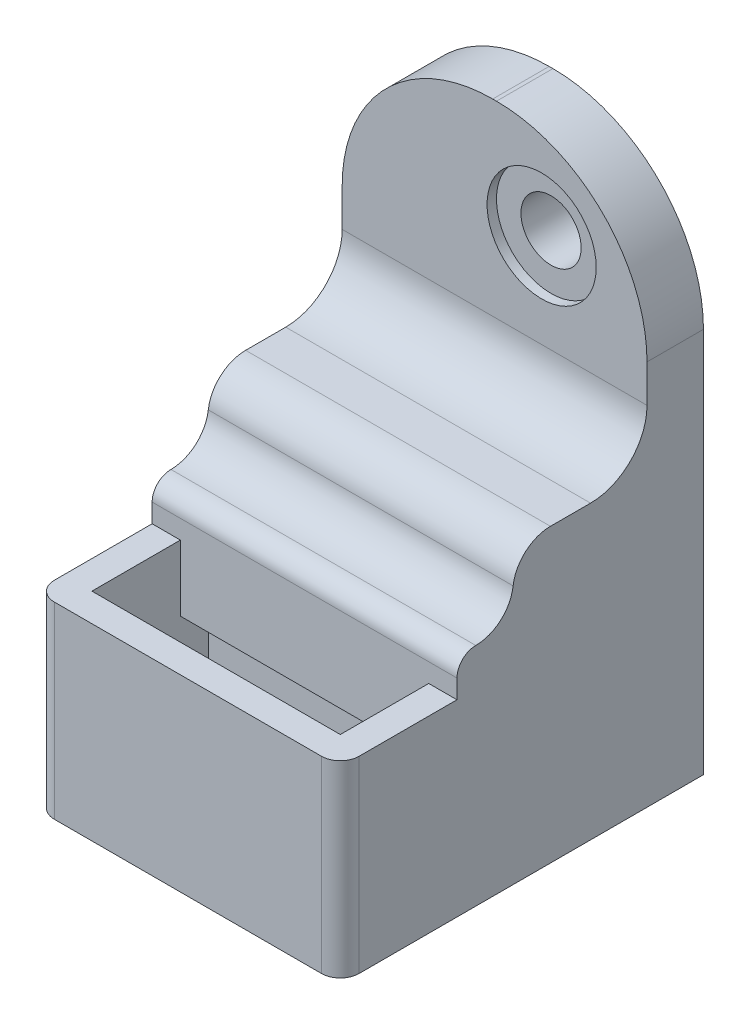
ISO-10303-21;
HEADER;
FILE_DESCRIPTION(('STEP AP214'),'2;1');
FILE_NAME('part.step','',(''),(''),'','','');
FILE_SCHEMA(('AUTOMOTIVE_DESIGN { 1 0 10303 214 1 1 1 1 }'));
ENDSEC;
DATA;
#1=APPLICATION_CONTEXT('core data for automotive mechanical design processes');
#2=APPLICATION_PROTOCOL_DEFINITION('international standard','automotive_design',2000,#1);
#3=PRODUCT_CONTEXT('',#1,'mechanical');
#4=PRODUCT('Part','Part','',(#3));
#5=PRODUCT_RELATED_PRODUCT_CATEGORY('part','',(#4));
#6=PRODUCT_DEFINITION_FORMATION('','',#4);
#7=PRODUCT_DEFINITION_CONTEXT('part definition',#1,'design');
#8=PRODUCT_DEFINITION('design','',#6,#7);
#9=PRODUCT_DEFINITION_SHAPE('','',#8);
#10=(LENGTH_UNIT() NAMED_UNIT(*) SI_UNIT(.MILLI.,.METRE.));
#11=(NAMED_UNIT(*) PLANE_ANGLE_UNIT() SI_UNIT($,.RADIAN.));
#12=(NAMED_UNIT(*) SI_UNIT($,.STERADIAN.) SOLID_ANGLE_UNIT());
#13=UNCERTAINTY_MEASURE_WITH_UNIT(LENGTH_MEASURE(1.E-05),#10,'distance_accuracy_value','');
#14=(GEOMETRIC_REPRESENTATION_CONTEXT(3) GLOBAL_UNCERTAINTY_ASSIGNED_CONTEXT((#13)) GLOBAL_UNIT_ASSIGNED_CONTEXT((#10,
#11,#12)) REPRESENTATION_CONTEXT('',''));
#15=CARTESIAN_POINT('',(0.,0.,0.));
#16=DIRECTION('',(0.,0.,1.));
#17=DIRECTION('',(1.,0.,0.));
#18=AXIS2_PLACEMENT_3D('',#15,#16,#17);
#19=CARTESIAN_POINT('',(0.,6.5,0.));
#20=DIRECTION('',(1.,0.,0.));
#21=DIRECTION('',(0.,0.,-1.));
#22=AXIS2_PLACEMENT_3D('',#19,#20,#21);
#23=PLANE('',#22);
#24=DIRECTION('',(0.,0.,-1.));
#25=VECTOR('',#24,1.);
#26=CARTESIAN_POINT('',(0.,3.,1.5));
#27=LINE('',#26,#25);
#28=CARTESIAN_POINT('',(0.,3.,1.5));
#29=VERTEX_POINT('',#28);
#30=CARTESIAN_POINT('',(0.,3.,0.));
#31=VERTEX_POINT('',#30);
#32=EDGE_CURVE('E209',#29,#31,#27,.T.);
#33=ORIENTED_EDGE('',*,*,#32,.F.);
#34=DIRECTION('',(0.,1.,0.));
#35=VECTOR('',#34,1.);
#36=CARTESIAN_POINT('',(0.,3.,1.5));
#37=LINE('',#36,#35);
#38=CARTESIAN_POINT('',(0.,6.5,1.5));
#39=VERTEX_POINT('',#38);
#40=EDGE_CURVE('E217',#29,#39,#37,.T.);
#41=ORIENTED_EDGE('',*,*,#40,.T.);
#42=DIRECTION('',(0.,0.,1.));
#43=VECTOR('',#42,1.);
#44=CARTESIAN_POINT('',(0.,6.5,0.));
#45=LINE('',#44,#43);
#46=CARTESIAN_POINT('',(0.,6.5,6.2));
#47=VERTEX_POINT('',#46);
#48=EDGE_CURVE('E331',#39,#47,#45,.T.);
#49=ORIENTED_EDGE('',*,*,#48,.T.);
#50=DIRECTION('',(0.,-1.,0.));
#51=VECTOR('',#50,1.);
#52=CARTESIAN_POINT('',(0.,6.5,6.2));
#53=LINE('',#52,#51);
#54=CARTESIAN_POINT('',(0.,-3.5,6.2));
#55=VERTEX_POINT('',#54);
#56=EDGE_CURVE('E343',#47,#55,#53,.T.);
#57=ORIENTED_EDGE('',*,*,#56,.T.);
#58=DIRECTION('',(0.,0.,-1.));
#59=VECTOR('',#58,1.);
#60=CARTESIAN_POINT('',(0.,-3.5,0.));
#61=LINE('',#60,#59);
#62=CARTESIAN_POINT('',(0.,-3.5,0.));
#63=VERTEX_POINT('',#62);
#64=EDGE_CURVE('E244',#55,#63,#61,.T.);
#65=ORIENTED_EDGE('',*,*,#64,.T.);
#66=DIRECTION('',(0.,-1.,0.));
#67=VECTOR('',#66,1.);
#68=CARTESIAN_POINT('',(0.,6.5,0.));
#69=LINE('',#68,#67);
#70=EDGE_CURVE('E229',#31,#63,#69,.T.);
#71=ORIENTED_EDGE('',*,*,#70,.F.);
#72=EDGE_LOOP('',(#33,#41,#49,#57,#65,#71));
#73=FACE_BOUND('',#72,.T.);
#74=ADVANCED_FACE('F33',(#73),#23,.T.);
#75=CARTESIAN_POINT('',(13.2,6.5,0.));
#76=DIRECTION('',(-1.,0.,0.));
#77=DIRECTION('',(0.,0.,1.));
#78=AXIS2_PLACEMENT_3D('',#75,#76,#77);
#79=PLANE('',#78);
#80=DIRECTION('',(0.,0.,-1.));
#81=VECTOR('',#80,1.);
#82=CARTESIAN_POINT('',(13.2,6.5,0.));
#83=LINE('',#82,#81);
#84=CARTESIAN_POINT('',(13.2,6.5,6.2));
#85=VERTEX_POINT('',#84);
#86=CARTESIAN_POINT('',(13.2,6.5,1.5));
#87=VERTEX_POINT('',#86);
#88=EDGE_CURVE('E335',#85,#87,#83,.T.);
#89=ORIENTED_EDGE('',*,*,#88,.T.);
#90=DIRECTION('',(0.,1.,0.));
#91=VECTOR('',#90,1.);
#92=CARTESIAN_POINT('',(13.2,3.,1.5));
#93=LINE('',#92,#91);
#94=CARTESIAN_POINT('',(13.2,3.,1.5));
#95=VERTEX_POINT('',#94);
#96=EDGE_CURVE('E225',#95,#87,#93,.T.);
#97=ORIENTED_EDGE('',*,*,#96,.F.);
#98=DIRECTION('',(0.,0.,1.));
#99=VECTOR('',#98,1.);
#100=CARTESIAN_POINT('',(13.2,3.,0.));
#101=LINE('',#100,#99);
#102=CARTESIAN_POINT('',(13.2,3.,0.));
#103=VERTEX_POINT('',#102);
#104=EDGE_CURVE('E212',#103,#95,#101,.T.);
#105=ORIENTED_EDGE('',*,*,#104,.F.);
#106=DIRECTION('',(0.,-1.,0.));
#107=VECTOR('',#106,1.);
#108=CARTESIAN_POINT('',(13.2,6.5,0.));
#109=LINE('',#108,#107);
#110=CARTESIAN_POINT('',(13.2,-3.5,0.));
#111=VERTEX_POINT('',#110);
#112=EDGE_CURVE('E339',#103,#111,#109,.T.);
#113=ORIENTED_EDGE('',*,*,#112,.T.);
#114=DIRECTION('',(0.,0.,1.));
#115=VECTOR('',#114,1.);
#116=CARTESIAN_POINT('',(13.2,-3.5,6.2));
#117=LINE('',#116,#115);
#118=CARTESIAN_POINT('',(13.2,-3.5,6.2));
#119=VERTEX_POINT('',#118);
#120=EDGE_CURVE('E238',#111,#119,#117,.T.);
#121=ORIENTED_EDGE('',*,*,#120,.T.);
#122=DIRECTION('',(0.,-1.,0.));
#123=VECTOR('',#122,1.);
#124=CARTESIAN_POINT('',(13.2,6.5,6.2));
#125=LINE('',#124,#123);
#126=EDGE_CURVE('E341',#85,#119,#125,.T.);
#127=ORIENTED_EDGE('',*,*,#126,.F.);
#128=EDGE_LOOP('',(#89,#97,#105,#113,#121,#127));
#129=FACE_BOUND('',#128,.T.);
#130=ADVANCED_FACE('F467',(#129),#79,.T.);
#131=CARTESIAN_POINT('',(9.1,20.,-16.1254833995939));
#132=DIRECTION('',(0.,0.,1.));
#133=DIRECTION('',(1.,0.,0.));
#134=AXIS2_PLACEMENT_3D('',#131,#132,#133);
#135=CYLINDRICAL_SURFACE('',#134,1.6);
#136=CARTESIAN_POINT('',(9.1,20.,-11.6));
#137=DIRECTION('',(0.,0.,1.));
#138=DIRECTION('',(1.,0.,0.));
#139=AXIS2_PLACEMENT_3D('',#136,#137,#138);
#140=CIRCLE('',#139,1.6);
#141=CARTESIAN_POINT('',(10.7,20.,-11.6));
#142=VERTEX_POINT('',#141);
#143=EDGE_CURVE('E289',#142,#142,#140,.F.);
#144=ORIENTED_EDGE('',*,*,#143,.T.);
#145=EDGE_LOOP('',(#144));
#146=FACE_BOUND('',#145,.T.);
#147=CARTESIAN_POINT('',(9.1,20.,-9.1));
#148=DIRECTION('',(0.,0.,1.));
#149=DIRECTION('',(1.,0.,0.));
#150=AXIS2_PLACEMENT_3D('',#147,#148,#149);
#151=CIRCLE('',#150,1.6);
#152=CARTESIAN_POINT('',(10.7,20.,-9.1));
#153=VERTEX_POINT('',#152);
#154=EDGE_CURVE('E280',#153,#153,#151,.F.);
#155=ORIENTED_EDGE('',*,*,#154,.F.);
#156=EDGE_LOOP('',(#155));
#157=FACE_BOUND('',#156,.T.);
#158=ADVANCED_FACE('F525',(#146,#157),#135,.F.);
#159=CARTESIAN_POINT('',(-1.5,12.,-3.5));
#160=DIRECTION('',(0.,-1.,0.));
#161=DIRECTION('',(1.,0.,0.));
#162=AXIS2_PLACEMENT_3D('',#159,#160,#161);
#163=PLANE('',#162);
#164=DIRECTION('',(0.,0.,1.));
#165=VECTOR('',#164,1.);
#166=CARTESIAN_POINT('',(14.7,12.,-3.5));
#167=LINE('',#166,#165);
#168=CARTESIAN_POINT('',(14.7,12.,-5.6));
#169=VERTEX_POINT('',#168);
#170=CARTESIAN_POINT('',(14.7,12.,-3.46862696659689));
#171=VERTEX_POINT('',#170);
#172=EDGE_CURVE('E327',#169,#171,#167,.T.);
#173=ORIENTED_EDGE('',*,*,#172,.F.);
#174=DIRECTION('',(1.,0.,0.));
#175=VECTOR('',#174,1.);
#176=CARTESIAN_POINT('',(-1.5,12.,-5.6));
#177=LINE('',#176,#175);
#178=CARTESIAN_POINT('',(-1.5,12.,-5.6));
#179=VERTEX_POINT('',#178);
#180=EDGE_CURVE('E396',#169,#179,#177,.F.);
#181=ORIENTED_EDGE('',*,*,#180,.T.);
#182=DIRECTION('',(0.,0.,1.));
#183=VECTOR('',#182,1.);
#184=CARTESIAN_POINT('',(-1.5,12.,-3.5));
#185=LINE('',#184,#183);
#186=CARTESIAN_POINT('',(-1.5,12.,-3.46862696659689));
#187=VERTEX_POINT('',#186);
#188=EDGE_CURVE('E329',#179,#187,#185,.T.);
#189=ORIENTED_EDGE('',*,*,#188,.T.);
#190=DIRECTION('',(1.,0.,0.));
#191=VECTOR('',#190,1.);
#192=CARTESIAN_POINT('',(-1.5,12.,-3.46862696659689));
#193=LINE('',#192,#191);
#194=EDGE_CURVE('E383',#187,#171,#193,.T.);
#195=ORIENTED_EDGE('',*,*,#194,.T.);
#196=EDGE_LOOP('',(#173,#181,#189,#195));
#197=FACE_BOUND('',#196,.T.);
#198=ADVANCED_FACE('F486',(#197),#163,.F.);
#199=CARTESIAN_POINT('',(0.,6.5,0.));
#200=DIRECTION('',(0.,1.,0.));
#201=DIRECTION('',(0.,0.,1.));
#202=AXIS2_PLACEMENT_3D('',#199,#200,#201);
#203=PLANE('',#202);
#204=DIRECTION('',(0.,0.,1.));
#205=VECTOR('',#204,1.);
#206=CARTESIAN_POINT('',(-1.5,6.5,-1.5));
#207=LINE('',#206,#205);
#208=CARTESIAN_POINT('',(-1.5,6.5,1.5));
#209=VERTEX_POINT('',#208);
#210=CARTESIAN_POINT('',(-1.5,6.5,6.7));
#211=VERTEX_POINT('',#210);
#212=EDGE_CURVE('E345',#209,#211,#207,.T.);
#213=ORIENTED_EDGE('',*,*,#212,.T.);
#214=CARTESIAN_POINT('',(-0.5,6.5,6.7));
#215=DIRECTION('',(0.,1.,0.));
#216=DIRECTION('',(0.,0.,1.));
#217=AXIS2_PLACEMENT_3D('',#214,#215,#216);
#218=CIRCLE('',#217,1.);
#219=CARTESIAN_POINT('',(-0.5,6.5,7.7));
#220=VERTEX_POINT('',#219);
#221=EDGE_CURVE('E363',#211,#220,#218,.T.);
#222=ORIENTED_EDGE('',*,*,#221,.T.);
#223=DIRECTION('',(1.,0.,0.));
#224=VECTOR('',#223,1.);
#225=CARTESIAN_POINT('',(-1.5,6.5,7.7));
#226=LINE('',#225,#224);
#227=CARTESIAN_POINT('',(13.7,6.5,7.7));
#228=VERTEX_POINT('',#227);
#229=EDGE_CURVE('E348',#220,#228,#226,.T.);
#230=ORIENTED_EDGE('',*,*,#229,.T.);
#231=CARTESIAN_POINT('',(13.7,6.5,6.7));
#232=DIRECTION('',(0.,1.,0.));
#233=DIRECTION('',(0.,0.,1.));
#234=AXIS2_PLACEMENT_3D('',#231,#232,#233);
#235=CIRCLE('',#234,1.);
#236=CARTESIAN_POINT('',(14.7,6.5,6.7));
#237=VERTEX_POINT('',#236);
#238=EDGE_CURVE('E361',#228,#237,#235,.T.);
#239=ORIENTED_EDGE('',*,*,#238,.T.);
#240=DIRECTION('',(0.,0.,-1.));
#241=VECTOR('',#240,1.);
#242=CARTESIAN_POINT('',(14.7,6.5,-1.5));
#243=LINE('',#242,#241);
#244=CARTESIAN_POINT('',(14.7,6.5,1.5));
#245=VERTEX_POINT('',#244);
#246=EDGE_CURVE('E351',#237,#245,#243,.T.);
#247=ORIENTED_EDGE('',*,*,#246,.T.);
#248=DIRECTION('',(1.,0.,0.));
#249=VECTOR('',#248,1.);
#250=CARTESIAN_POINT('',(14.7,6.5,1.5));
#251=LINE('',#250,#249);
#252=EDGE_CURVE('E287',#87,#245,#251,.T.);
#253=ORIENTED_EDGE('',*,*,#252,.F.);
#254=ORIENTED_EDGE('',*,*,#88,.F.);
#255=DIRECTION('',(1.,0.,0.));
#256=VECTOR('',#255,1.);
#257=CARTESIAN_POINT('',(0.,6.5,6.2));
#258=LINE('',#257,#256);
#259=EDGE_CURVE('E333',#47,#85,#258,.T.);
#260=ORIENTED_EDGE('',*,*,#259,.F.);
#261=ORIENTED_EDGE('',*,*,#48,.F.);
#262=EDGE_CURVE('E221',#209,#39,#251,.T.);
#263=ORIENTED_EDGE('',*,*,#262,.F.);
#264=EDGE_LOOP('',(#213,#222,#230,#239,#247,#253,#254,#260,#261,#263));
#265=FACE_BOUND('',#264,.T.);
#266=ADVANCED_FACE('F452',(#265),#203,.T.);
#267=CARTESIAN_POINT('',(-1.5,6.5,-1.5));
#268=DIRECTION('',(1.,0.,0.));
#269=DIRECTION('',(0.,0.,-1.));
#270=AXIS2_PLACEMENT_3D('',#267,#268,#269);
#271=PLANE('',#270);
#272=DIRECTION('',(0.,-1.,0.));
#273=VECTOR('',#272,1.);
#274=CARTESIAN_POINT('',(-1.5,25.,-8.6));
#275=LINE('',#274,#273);
#276=CARTESIAN_POINT('',(-1.5,17.,-8.6));
#277=VERTEX_POINT('',#276);
#278=CARTESIAN_POINT('',(-1.5,15.,-8.6));
#279=VERTEX_POINT('',#278);
#280=EDGE_CURVE('E300',#277,#279,#275,.T.);
#281=ORIENTED_EDGE('',*,*,#280,.F.);
#282=DIRECTION('',(0.,0.,1.));
#283=VECTOR('',#282,1.);
#284=CARTESIAN_POINT('',(-1.5,17.,-1.5));
#285=LINE('',#284,#283);
#286=CARTESIAN_POINT('',(-1.5,17.,-11.6));
#287=VERTEX_POINT('',#286);
#288=EDGE_CURVE('E11',#277,#287,#285,.F.);
#289=ORIENTED_EDGE('',*,*,#288,.T.);
#290=DIRECTION('',(0.,1.,0.));
#291=VECTOR('',#290,1.);
#292=CARTESIAN_POINT('',(-1.5,0.,-11.6));
#293=LINE('',#292,#291);
#294=CARTESIAN_POINT('',(-1.5,-3.5,-11.6));
#295=VERTEX_POINT('',#294);
#296=EDGE_CURVE('E303',#295,#287,#293,.T.);
#297=ORIENTED_EDGE('',*,*,#296,.F.);
#298=DIRECTION('',(0.,0.,-1.));
#299=VECTOR('',#298,1.);
#300=CARTESIAN_POINT('',(-1.5,-3.5,6.7));
#301=LINE('',#300,#299);
#302=CARTESIAN_POINT('',(-1.5,-3.5,6.7));
#303=VERTEX_POINT('',#302);
#304=EDGE_CURVE('E255',#303,#295,#301,.T.);
#305=ORIENTED_EDGE('',*,*,#304,.F.);
#306=DIRECTION('',(0.,-1.,0.));
#307=VECTOR('',#306,1.);
#308=CARTESIAN_POINT('',(-1.5,6.5,6.7));
#309=LINE('',#308,#307);
#310=EDGE_CURVE('E359',#303,#211,#309,.F.);
#311=ORIENTED_EDGE('',*,*,#310,.T.);
#312=ORIENTED_EDGE('',*,*,#212,.F.);
#313=DIRECTION('',(0.,-1.,0.));
#314=VECTOR('',#313,1.);
#315=CARTESIAN_POINT('',(-1.5,6.5,1.5));
#316=LINE('',#315,#314);
#317=CARTESIAN_POINT('',(-1.5,7.5,1.5));
#318=VERTEX_POINT('',#317);
#319=EDGE_CURVE('E285',#318,#209,#316,.T.);
#320=ORIENTED_EDGE('',*,*,#319,.F.);
#321=CARTESIAN_POINT('',(-1.5,7.5,0.5));
#322=DIRECTION('',(1.,0.,0.));
#323=DIRECTION('',(0.,0.,-1.));
#324=AXIS2_PLACEMENT_3D('',#321,#322,#323);
#325=CIRCLE('',#324,1.);
#326=CARTESIAN_POINT('',(-1.5,8.5,0.5));
#327=VERTEX_POINT('',#326);
#328=EDGE_CURVE('E370',#318,#327,#325,.F.);
#329=ORIENTED_EDGE('',*,*,#328,.T.);
#330=CARTESIAN_POINT('',(-1.5,10.5,0.5));
#331=DIRECTION('',(1.,0.,0.));
#332=DIRECTION('',(0.,0.,-1.));
#333=AXIS2_PLACEMENT_3D('',#330,#331,#332);
#334=CIRCLE('',#333,2.);
#335=CARTESIAN_POINT('',(-1.5,10.25,-1.48431348329844));
#336=VERTEX_POINT('',#335);
#337=EDGE_CURVE('E378',#327,#336,#334,.T.);
#338=ORIENTED_EDGE('',*,*,#337,.T.);
#339=CARTESIAN_POINT('',(-1.5,10.,-3.46862696659689));
#340=DIRECTION('',(1.,0.,0.));
#341=DIRECTION('',(0.,0.,-1.));
#342=AXIS2_PLACEMENT_3D('',#339,#340,#341);
#343=CIRCLE('',#342,2.);
#344=EDGE_CURVE('E390',#336,#187,#343,.F.);
#345=ORIENTED_EDGE('',*,*,#344,.T.);
#346=ORIENTED_EDGE('',*,*,#188,.F.);
#347=CARTESIAN_POINT('',(-1.5,15.,-5.6));
#348=DIRECTION('',(1.,0.,0.));
#349=DIRECTION('',(0.,0.,-1.));
#350=AXIS2_PLACEMENT_3D('',#347,#348,#349);
#351=CIRCLE('',#350,3.);
#352=EDGE_CURVE('E400',#179,#279,#351,.T.);
#353=ORIENTED_EDGE('',*,*,#352,.T.);
#354=EDGE_LOOP('',(#281,#289,#297,#305,#311,#312,#320,#329,#338,#345,#346,#353));
#355=FACE_BOUND('',#354,.T.);
#356=ADVANCED_FACE('F449',(#355),#271,.F.);
#357=CARTESIAN_POINT('',(-1.5,6.5,7.7));
#358=DIRECTION('',(0.,0.,-1.));
#359=DIRECTION('',(-1.,0.,0.));
#360=AXIS2_PLACEMENT_3D('',#357,#358,#359);
#361=PLANE('',#360);
#362=ORIENTED_EDGE('',*,*,#229,.F.);
#363=DIRECTION('',(0.,-1.,0.));
#364=VECTOR('',#363,1.);
#365=CARTESIAN_POINT('',(-0.5,6.5,7.7));
#366=LINE('',#365,#364);
#367=CARTESIAN_POINT('',(-0.5,-3.5,7.7));
#368=VERTEX_POINT('',#367);
#369=EDGE_CURVE('E357',#220,#368,#366,.T.);
#370=ORIENTED_EDGE('',*,*,#369,.T.);
#371=DIRECTION('',(-1.,0.,0.));
#372=VECTOR('',#371,1.);
#373=CARTESIAN_POINT('',(13.7,-3.5,7.7));
#374=LINE('',#373,#372);
#375=CARTESIAN_POINT('',(13.7,-3.5,7.7));
#376=VERTEX_POINT('',#375);
#377=EDGE_CURVE('E249',#376,#368,#374,.T.);
#378=ORIENTED_EDGE('',*,*,#377,.F.);
#379=DIRECTION('',(0.,-1.,0.));
#380=VECTOR('',#379,1.);
#381=CARTESIAN_POINT('',(13.7,6.5,7.7));
#382=LINE('',#381,#380);
#383=EDGE_CURVE('E353',#376,#228,#382,.F.);
#384=ORIENTED_EDGE('',*,*,#383,.T.);
#385=EDGE_LOOP('',(#362,#370,#378,#384));
#386=FACE_BOUND('',#385,.T.);
#387=ADVANCED_FACE('F440',(#386),#361,.F.);
#388=CARTESIAN_POINT('',(14.7,6.5,-1.5));
#389=DIRECTION('',(-1.,0.,0.));
#390=DIRECTION('',(0.,0.,1.));
#391=AXIS2_PLACEMENT_3D('',#388,#389,#390);
#392=PLANE('',#391);
#393=DIRECTION('',(0.,-1.,0.));
#394=VECTOR('',#393,1.);
#395=CARTESIAN_POINT('',(14.7,12.,-11.6));
#396=LINE('',#395,#394);
#397=CARTESIAN_POINT('',(14.7,17.,-11.6));
#398=VERTEX_POINT('',#397);
#399=CARTESIAN_POINT('',(14.7,-3.5,-11.6));
#400=VERTEX_POINT('',#399);
#401=EDGE_CURVE('E306',#398,#400,#396,.T.);
#402=ORIENTED_EDGE('',*,*,#401,.F.);
#403=DIRECTION('',(0.,0.,-1.));
#404=VECTOR('',#403,1.);
#405=CARTESIAN_POINT('',(14.7,17.,-1.5));
#406=LINE('',#405,#404);
#407=CARTESIAN_POINT('',(14.7,17.,-8.6));
#408=VERTEX_POINT('',#407);
#409=EDGE_CURVE('E56',#398,#408,#406,.F.);
#410=ORIENTED_EDGE('',*,*,#409,.T.);
#411=DIRECTION('',(0.,-1.,0.));
#412=VECTOR('',#411,1.);
#413=CARTESIAN_POINT('',(14.7,25.,-8.6));
#414=LINE('',#413,#412);
#415=CARTESIAN_POINT('',(14.7,15.,-8.6));
#416=VERTEX_POINT('',#415);
#417=EDGE_CURVE('E298',#408,#416,#414,.T.);
#418=ORIENTED_EDGE('',*,*,#417,.T.);
#419=CARTESIAN_POINT('',(14.7,15.,-5.6));
#420=DIRECTION('',(-1.,0.,0.));
#421=DIRECTION('',(0.,0.,1.));
#422=AXIS2_PLACEMENT_3D('',#419,#420,#421);
#423=CIRCLE('',#422,3.);
#424=EDGE_CURVE('E398',#416,#169,#423,.T.);
#425=ORIENTED_EDGE('',*,*,#424,.T.);
#426=ORIENTED_EDGE('',*,*,#172,.T.);
#427=CARTESIAN_POINT('',(14.7,10.,-3.46862696659689));
#428=DIRECTION('',(-1.,0.,0.));
#429=DIRECTION('',(0.,0.,1.));
#430=AXIS2_PLACEMENT_3D('',#427,#428,#429);
#431=CIRCLE('',#430,2.);
#432=CARTESIAN_POINT('',(14.7,10.25,-1.48431348329844));
#433=VERTEX_POINT('',#432);
#434=EDGE_CURVE('E386',#171,#433,#431,.F.);
#435=ORIENTED_EDGE('',*,*,#434,.T.);
#436=CARTESIAN_POINT('',(14.7,10.5,0.5));
#437=DIRECTION('',(-1.,0.,0.));
#438=DIRECTION('',(0.,0.,1.));
#439=AXIS2_PLACEMENT_3D('',#436,#437,#438);
#440=CIRCLE('',#439,2.);
#441=CARTESIAN_POINT('',(14.7,8.5,0.5));
#442=VERTEX_POINT('',#441);
#443=EDGE_CURVE('E381',#433,#442,#440,.T.);
#444=ORIENTED_EDGE('',*,*,#443,.T.);
#445=CARTESIAN_POINT('',(14.7,7.5,0.5));
#446=DIRECTION('',(-1.,0.,0.));
#447=DIRECTION('',(0.,0.,1.));
#448=AXIS2_PLACEMENT_3D('',#445,#446,#447);
#449=CIRCLE('',#448,1.);
#450=CARTESIAN_POINT('',(14.7,7.5,1.5));
#451=VERTEX_POINT('',#450);
#452=EDGE_CURVE('E376',#442,#451,#449,.F.);
#453=ORIENTED_EDGE('',*,*,#452,.T.);
#454=DIRECTION('',(0.,1.,0.));
#455=VECTOR('',#454,1.);
#456=CARTESIAN_POINT('',(14.7,6.5,1.5));
#457=LINE('',#456,#455);
#458=EDGE_CURVE('E283',#245,#451,#457,.T.);
#459=ORIENTED_EDGE('',*,*,#458,.F.);
#460=ORIENTED_EDGE('',*,*,#246,.F.);
#461=DIRECTION('',(0.,-1.,0.));
#462=VECTOR('',#461,1.);
#463=CARTESIAN_POINT('',(14.7,6.5,6.7));
#464=LINE('',#463,#462);
#465=CARTESIAN_POINT('',(14.7,-3.5,6.7));
#466=VERTEX_POINT('',#465);
#467=EDGE_CURVE('E365',#237,#466,#464,.T.);
#468=ORIENTED_EDGE('',*,*,#467,.T.);
#469=DIRECTION('',(0.,0.,1.));
#470=VECTOR('',#469,1.);
#471=CARTESIAN_POINT('',(14.7,-3.5,-11.6));
#472=LINE('',#471,#470);
#473=EDGE_CURVE('E273',#400,#466,#472,.T.);
#474=ORIENTED_EDGE('',*,*,#473,.F.);
#475=EDGE_LOOP('',(#402,#410,#418,#425,#426,#435,#444,#453,#459,#460,#468,#474));
#476=FACE_BOUND('',#475,.T.);
#477=ADVANCED_FACE('F427',(#476),#392,.F.);
#478=CARTESIAN_POINT('',(0.,6.5,6.2));
#479=DIRECTION('',(0.,0.,-1.));
#480=DIRECTION('',(-1.,0.,0.));
#481=AXIS2_PLACEMENT_3D('',#478,#479,#480);
#482=PLANE('',#481);
#483=ORIENTED_EDGE('',*,*,#126,.T.);
#484=DIRECTION('',(-1.,0.,0.));
#485=VECTOR('',#484,1.);
#486=CARTESIAN_POINT('',(0.,-3.5,6.2));
#487=LINE('',#486,#485);
#488=EDGE_CURVE('E241',#119,#55,#487,.T.);
#489=ORIENTED_EDGE('',*,*,#488,.T.);
#490=ORIENTED_EDGE('',*,*,#56,.F.);
#491=ORIENTED_EDGE('',*,*,#259,.T.);
#492=EDGE_LOOP('',(#483,#489,#490,#491));
#493=FACE_BOUND('',#492,.T.);
#494=ADVANCED_FACE('F457',(#493),#482,.T.);
#495=CARTESIAN_POINT('',(0.,6.5,0.));
#496=DIRECTION('',(0.,0.,1.));
#497=DIRECTION('',(1.,0.,0.));
#498=AXIS2_PLACEMENT_3D('',#495,#496,#497);
#499=PLANE('',#498);
#500=DIRECTION('',(1.,0.,0.));
#501=VECTOR('',#500,1.);
#502=CARTESIAN_POINT('',(0.,3.,0.));
#503=LINE('',#502,#501);
#504=EDGE_CURVE('E230',#31,#103,#503,.T.);
#505=ORIENTED_EDGE('',*,*,#504,.F.);
#506=ORIENTED_EDGE('',*,*,#70,.T.);
#507=DIRECTION('',(1.,0.,0.));
#508=VECTOR('',#507,1.);
#509=CARTESIAN_POINT('',(13.2,-3.5,0.));
#510=LINE('',#509,#508);
#511=EDGE_CURVE('E224',#63,#111,#510,.T.);
#512=ORIENTED_EDGE('',*,*,#511,.T.);
#513=ORIENTED_EDGE('',*,*,#112,.F.);
#514=EDGE_LOOP('',(#505,#506,#512,#513));
#515=FACE_BOUND('',#514,.T.);
#516=ADVANCED_FACE('F465',(#515),#499,.T.);
#517=CARTESIAN_POINT('',(0.,0.,-3.5));
#518=DIRECTION('',(0.,0.,-1.));
#519=DIRECTION('',(-1.,0.,0.));
#520=AXIS2_PLACEMENT_3D('',#517,#518,#519);
#521=PLANE('',#520);
#522=DIRECTION('',(0.,-1.,0.));
#523=VECTOR('',#522,1.);
#524=CARTESIAN_POINT('',(0.3,0.,-3.5));
#525=LINE('',#524,#523);
#526=CARTESIAN_POINT('',(0.3,10.,-3.5));
#527=VERTEX_POINT('',#526);
#528=CARTESIAN_POINT('',(0.3,-3.5,-3.5));
#529=VERTEX_POINT('',#528);
#530=EDGE_CURVE('E307',#527,#529,#525,.T.);
#531=ORIENTED_EDGE('',*,*,#530,.F.);
#532=DIRECTION('',(-1.,0.,0.));
#533=VECTOR('',#532,1.);
#534=CARTESIAN_POINT('',(0.3,10.,-3.5));
#535=LINE('',#534,#533);
#536=CARTESIAN_POINT('',(12.9,10.,-3.5));
#537=VERTEX_POINT('',#536);
#538=EDGE_CURVE('E318',#537,#527,#535,.T.);
#539=ORIENTED_EDGE('',*,*,#538,.F.);
#540=DIRECTION('',(0.,1.,0.));
#541=VECTOR('',#540,1.);
#542=CARTESIAN_POINT('',(12.9,10.,-3.5));
#543=LINE('',#542,#541);
#544=CARTESIAN_POINT('',(12.9,-3.5,-3.5));
#545=VERTEX_POINT('',#544);
#546=EDGE_CURVE('E302',#545,#537,#543,.T.);
#547=ORIENTED_EDGE('',*,*,#546,.F.);
#548=DIRECTION('',(1.,0.,0.));
#549=VECTOR('',#548,1.);
#550=CARTESIAN_POINT('',(0.3,-3.5,-3.5));
#551=LINE('',#550,#549);
#552=EDGE_CURVE('E264',#529,#545,#551,.T.);
#553=ORIENTED_EDGE('',*,*,#552,.F.);
#554=EDGE_LOOP('',(#531,#539,#547,#553));
#555=FACE_BOUND('',#554,.T.);
#556=ADVANCED_FACE('F504',(#555),#521,.T.);
#557=CARTESIAN_POINT('',(12.9,10.,-11.6));
#558=DIRECTION('',(1.,0.,0.));
#559=DIRECTION('',(0.,1.,0.));
#560=AXIS2_PLACEMENT_3D('',#557,#558,#559);
#561=PLANE('',#560);
#562=ORIENTED_EDGE('',*,*,#546,.T.);
#563=DIRECTION('',(0.,0.,1.));
#564=VECTOR('',#563,1.);
#565=CARTESIAN_POINT('',(12.9,10.,-11.6));
#566=LINE('',#565,#564);
#567=CARTESIAN_POINT('',(12.9,10.,-11.6));
#568=VERTEX_POINT('',#567);
#569=EDGE_CURVE('E324',#568,#537,#566,.T.);
#570=ORIENTED_EDGE('',*,*,#569,.F.);
#571=DIRECTION('',(0.,1.,0.));
#572=VECTOR('',#571,1.);
#573=CARTESIAN_POINT('',(12.9,10.,-11.6));
#574=LINE('',#573,#572);
#575=CARTESIAN_POINT('',(12.9,-3.5,-11.6));
#576=VERTEX_POINT('',#575);
#577=EDGE_CURVE('E309',#576,#568,#574,.T.);
#578=ORIENTED_EDGE('',*,*,#577,.F.);
#579=DIRECTION('',(0.,0.,-1.));
#580=VECTOR('',#579,1.);
#581=CARTESIAN_POINT('',(12.9,-3.5,-3.5));
#582=LINE('',#581,#580);
#583=EDGE_CURVE('E267',#545,#576,#582,.T.);
#584=ORIENTED_EDGE('',*,*,#583,.F.);
#585=EDGE_LOOP('',(#562,#570,#578,#584));
#586=FACE_BOUND('',#585,.T.);
#587=ADVANCED_FACE('F510',(#586),#561,.F.);
#588=CARTESIAN_POINT('',(0.3,10.,-11.6));
#589=DIRECTION('',(0.,1.,0.));
#590=DIRECTION('',(-1.,0.,0.));
#591=AXIS2_PLACEMENT_3D('',#588,#589,#590);
#592=PLANE('',#591);
#593=ORIENTED_EDGE('',*,*,#538,.T.);
#594=DIRECTION('',(0.,0.,1.));
#595=VECTOR('',#594,1.);
#596=CARTESIAN_POINT('',(0.3,10.,-11.6));
#597=LINE('',#596,#595);
#598=CARTESIAN_POINT('',(0.3,10.,-11.6));
#599=VERTEX_POINT('',#598);
#600=EDGE_CURVE('E315',#599,#527,#597,.T.);
#601=ORIENTED_EDGE('',*,*,#600,.F.);
#602=DIRECTION('',(-1.,0.,0.));
#603=VECTOR('',#602,1.);
#604=CARTESIAN_POINT('',(0.3,10.,-11.6));
#605=LINE('',#604,#603);
#606=EDGE_CURVE('E311',#568,#599,#605,.T.);
#607=ORIENTED_EDGE('',*,*,#606,.F.);
#608=ORIENTED_EDGE('',*,*,#569,.T.);
#609=EDGE_LOOP('',(#593,#601,#607,#608));
#610=FACE_BOUND('',#609,.T.);
#611=ADVANCED_FACE('F506',(#610),#592,.F.);
#612=CARTESIAN_POINT('',(0.3,0.,-11.6));
#613=DIRECTION('',(-1.,0.,0.));
#614=DIRECTION('',(0.,0.,1.));
#615=AXIS2_PLACEMENT_3D('',#612,#613,#614);
#616=PLANE('',#615);
#617=ORIENTED_EDGE('',*,*,#530,.T.);
#618=DIRECTION('',(0.,0.,1.));
#619=VECTOR('',#618,1.);
#620=CARTESIAN_POINT('',(0.3,-3.5,-11.6));
#621=LINE('',#620,#619);
#622=CARTESIAN_POINT('',(0.3,-3.5,-11.6));
#623=VERTEX_POINT('',#622);
#624=EDGE_CURVE('E261',#623,#529,#621,.T.);
#625=ORIENTED_EDGE('',*,*,#624,.F.);
#626=DIRECTION('',(0.,-1.,0.));
#627=VECTOR('',#626,1.);
#628=CARTESIAN_POINT('',(0.3,0.,-11.6));
#629=LINE('',#628,#627);
#630=EDGE_CURVE('E313',#599,#623,#629,.T.);
#631=ORIENTED_EDGE('',*,*,#630,.F.);
#632=ORIENTED_EDGE('',*,*,#600,.T.);
#633=EDGE_LOOP('',(#617,#625,#631,#632));
#634=FACE_BOUND('',#633,.T.);
#635=ADVANCED_FACE('F501',(#634),#616,.F.);
#636=CARTESIAN_POINT('',(0.,0.,-11.6));
#637=DIRECTION('',(0.,0.,1.));
#638=DIRECTION('',(1.,0.,0.));
#639=AXIS2_PLACEMENT_3D('',#636,#637,#638);
#640=PLANE('',#639);
#641=ORIENTED_EDGE('',*,*,#143,.F.);
#642=EDGE_LOOP('',(#641));
#643=FACE_BOUND('',#642,.T.);
#644=DIRECTION('',(-1.,0.,0.));
#645=VECTOR('',#644,1.);
#646=CARTESIAN_POINT('',(14.7,25.,-11.6));
#647=LINE('',#646,#645);
#648=CARTESIAN_POINT('',(6.7,25.,-11.6));
#649=VERTEX_POINT('',#648);
#650=CARTESIAN_POINT('',(6.5,25.,-11.6));
#651=VERTEX_POINT('',#650);
#652=EDGE_CURVE('E292',#649,#651,#647,.T.);
#653=ORIENTED_EDGE('',*,*,#652,.F.);
#654=CARTESIAN_POINT('',(6.7,17.,-11.6));
#655=DIRECTION('',(0.,0.,1.));
#656=DIRECTION('',(1.,0.,0.));
#657=AXIS2_PLACEMENT_3D('',#654,#655,#656);
#658=CIRCLE('',#657,8.);
#659=EDGE_CURVE('E411',#649,#398,#658,.F.);
#660=ORIENTED_EDGE('',*,*,#659,.T.);
#661=ORIENTED_EDGE('',*,*,#401,.T.);
#662=DIRECTION('',(1.,0.,0.));
#663=VECTOR('',#662,1.);
#664=CARTESIAN_POINT('',(12.9,-3.5,-11.6));
#665=LINE('',#664,#663);
#666=EDGE_CURVE('E270',#576,#400,#665,.T.);
#667=ORIENTED_EDGE('',*,*,#666,.F.);
#668=ORIENTED_EDGE('',*,*,#577,.T.);
#669=ORIENTED_EDGE('',*,*,#606,.T.);
#670=ORIENTED_EDGE('',*,*,#630,.T.);
#671=DIRECTION('',(1.,0.,0.));
#672=VECTOR('',#671,1.);
#673=CARTESIAN_POINT('',(-1.5,-3.5,-11.6));
#674=LINE('',#673,#672);
#675=EDGE_CURVE('E258',#295,#623,#674,.T.);
#676=ORIENTED_EDGE('',*,*,#675,.F.);
#677=ORIENTED_EDGE('',*,*,#296,.T.);
#678=CARTESIAN_POINT('',(6.5,17.,-11.6));
#679=DIRECTION('',(0.,0.,1.));
#680=DIRECTION('',(1.,0.,0.));
#681=AXIS2_PLACEMENT_3D('',#678,#679,#680);
#682=CIRCLE('',#681,8.);
#683=EDGE_CURVE('E409',#287,#651,#682,.F.);
#684=ORIENTED_EDGE('',*,*,#683,.T.);
#685=EDGE_LOOP('',(#653,#660,#661,#667,#668,#669,#670,#676,#677,#684));
#686=FACE_BOUND('',#685,.T.);
#687=ADVANCED_FACE('F424',(#643,#686),#640,.F.);
#688=CARTESIAN_POINT('',(14.7,25.,-8.6));
#689=DIRECTION('',(0.,0.,-1.));
#690=DIRECTION('',(-1.,0.,0.));
#691=AXIS2_PLACEMENT_3D('',#688,#689,#690);
#692=PLANE('',#691);
#693=CARTESIAN_POINT('',(9.1,20.,-8.6));
#694=DIRECTION('',(0.,0.,1.));
#695=DIRECTION('',(1.,0.,0.));
#696=AXIS2_PLACEMENT_3D('',#693,#694,#695);
#697=CIRCLE('',#696,2.9);
#698=CARTESIAN_POINT('',(12.,20.,-8.6));
#699=VERTEX_POINT('',#698);
#700=EDGE_CURVE('E276',#699,#699,#697,.T.);
#701=ORIENTED_EDGE('',*,*,#700,.F.);
#702=EDGE_LOOP('',(#701));
#703=FACE_BOUND('',#702,.T.);
#704=ORIENTED_EDGE('',*,*,#417,.F.);
#705=CARTESIAN_POINT('',(6.7,17.,-8.6));
#706=DIRECTION('',(0.,0.,-1.));
#707=DIRECTION('',(-1.,0.,0.));
#708=AXIS2_PLACEMENT_3D('',#705,#706,#707);
#709=CIRCLE('',#708,8.);
#710=CARTESIAN_POINT('',(6.7,25.,-8.6));
#711=VERTEX_POINT('',#710);
#712=EDGE_CURVE('E41',#408,#711,#709,.F.);
#713=ORIENTED_EDGE('',*,*,#712,.T.);
#714=DIRECTION('',(1.,0.,0.));
#715=VECTOR('',#714,1.);
#716=CARTESIAN_POINT('',(14.7,25.,-8.6));
#717=LINE('',#716,#715);
#718=CARTESIAN_POINT('',(6.5,25.,-8.6));
#719=VERTEX_POINT('',#718);
#720=EDGE_CURVE('E295',#719,#711,#717,.T.);
#721=ORIENTED_EDGE('',*,*,#720,.F.);
#722=CARTESIAN_POINT('',(6.5,17.,-8.6));
#723=DIRECTION('',(0.,0.,-1.));
#724=DIRECTION('',(-1.,0.,0.));
#725=AXIS2_PLACEMENT_3D('',#722,#723,#724);
#726=CIRCLE('',#725,8.);
#727=EDGE_CURVE('E48',#719,#277,#726,.F.);
#728=ORIENTED_EDGE('',*,*,#727,.T.);
#729=ORIENTED_EDGE('',*,*,#280,.T.);
#730=DIRECTION('',(1.,0.,0.));
#731=VECTOR('',#730,1.);
#732=CARTESIAN_POINT('',(14.7,15.,-8.6));
#733=LINE('',#732,#731);
#734=EDGE_CURVE('E393',#279,#416,#733,.T.);
#735=ORIENTED_EDGE('',*,*,#734,.T.);
#736=EDGE_LOOP('',(#704,#713,#721,#728,#729,#735));
#737=FACE_BOUND('',#736,.T.);
#738=ADVANCED_FACE('F415',(#703,#737),#692,.F.);
#739=CARTESIAN_POINT('',(0.,25.,0.));
#740=DIRECTION('',(0.,-1.,0.));
#741=DIRECTION('',(1.,0.,0.));
#742=AXIS2_PLACEMENT_3D('',#739,#740,#741);
#743=PLANE('',#742);
#744=ORIENTED_EDGE('',*,*,#720,.T.);
#745=DIRECTION('',(0.,0.,-1.));
#746=VECTOR('',#745,1.);
#747=CARTESIAN_POINT('',(6.7,25.,0.));
#748=LINE('',#747,#746);
#749=EDGE_CURVE('E406',#711,#649,#748,.T.);
#750=ORIENTED_EDGE('',*,*,#749,.T.);
#751=ORIENTED_EDGE('',*,*,#652,.T.);
#752=DIRECTION('',(0.,0.,1.));
#753=VECTOR('',#752,1.);
#754=CARTESIAN_POINT('',(6.5,25.,0.));
#755=LINE('',#754,#753);
#756=EDGE_CURVE('E403',#651,#719,#755,.T.);
#757=ORIENTED_EDGE('',*,*,#756,.T.);
#758=EDGE_LOOP('',(#744,#750,#751,#757));
#759=FACE_BOUND('',#758,.T.);
#760=ADVANCED_FACE('F419',(#759),#743,.F.);
#761=CARTESIAN_POINT('',(0.,0.,1.5));
#762=DIRECTION('',(0.,0.,1.));
#763=DIRECTION('',(1.,0.,0.));
#764=AXIS2_PLACEMENT_3D('',#761,#762,#763);
#765=PLANE('',#764);
#766=ORIENTED_EDGE('',*,*,#458,.T.);
#767=DIRECTION('',(-1.,0.,0.));
#768=VECTOR('',#767,1.);
#769=CARTESIAN_POINT('',(-1.5,7.5,1.5));
#770=LINE('',#769,#768);
#771=EDGE_CURVE('E367',#451,#318,#770,.T.);
#772=ORIENTED_EDGE('',*,*,#771,.T.);
#773=ORIENTED_EDGE('',*,*,#319,.T.);
#774=ORIENTED_EDGE('',*,*,#262,.T.);
#775=ORIENTED_EDGE('',*,*,#40,.F.);
#776=DIRECTION('',(-1.,0.,0.));
#777=VECTOR('',#776,1.);
#778=CARTESIAN_POINT('',(13.2,3.,1.5));
#779=LINE('',#778,#777);
#780=EDGE_CURVE('E205',#95,#29,#779,.T.);
#781=ORIENTED_EDGE('',*,*,#780,.F.);
#782=ORIENTED_EDGE('',*,*,#96,.T.);
#783=ORIENTED_EDGE('',*,*,#252,.T.);
#784=EDGE_LOOP('',(#766,#772,#773,#774,#775,#781,#782,#783));
#785=FACE_BOUND('',#784,.T.);
#786=ADVANCED_FACE('F219',(#785),#765,.T.);
#787=CARTESIAN_POINT('',(9.1,20.,-9.1));
#788=DIRECTION('',(0.,0.,1.));
#789=DIRECTION('',(1.,0.,0.));
#790=AXIS2_PLACEMENT_3D('',#787,#788,#789);
#791=PLANE('',#790);
#792=CARTESIAN_POINT('',(9.1,20.,-9.1));
#793=DIRECTION('',(0.,0.,1.));
#794=DIRECTION('',(1.,0.,0.));
#795=AXIS2_PLACEMENT_3D('',#792,#793,#794);
#796=CIRCLE('',#795,2.9);
#797=CARTESIAN_POINT('',(12.,20.,-9.1));
#798=VERTEX_POINT('',#797);
#799=EDGE_CURVE('E277',#798,#798,#796,.T.);
#800=ORIENTED_EDGE('',*,*,#799,.T.);
#801=EDGE_LOOP('',(#800));
#802=FACE_BOUND('',#801,.T.);
#803=ORIENTED_EDGE('',*,*,#154,.T.);
#804=EDGE_LOOP('',(#803));
#805=FACE_BOUND('',#804,.T.);
#806=ADVANCED_FACE('F563',(#802,#805),#791,.T.);
#807=CARTESIAN_POINT('',(9.1,20.,-9.1));
#808=DIRECTION('',(0.,0.,1.));
#809=DIRECTION('',(1.,0.,0.));
#810=AXIS2_PLACEMENT_3D('',#807,#808,#809);
#811=CYLINDRICAL_SURFACE('',#810,2.9);
#812=ORIENTED_EDGE('',*,*,#799,.F.);
#813=EDGE_LOOP('',(#812));
#814=FACE_BOUND('',#813,.T.);
#815=ORIENTED_EDGE('',*,*,#700,.T.);
#816=EDGE_LOOP('',(#815));
#817=FACE_BOUND('',#816,.T.);
#818=ADVANCED_FACE('F539',(#814,#817),#811,.F.);
#819=CARTESIAN_POINT('',(-0.5,6.5,6.7));
#820=DIRECTION('',(0.,-1.,0.));
#821=DIRECTION('',(0.,0.,-1.));
#822=AXIS2_PLACEMENT_3D('',#819,#820,#821);
#823=CYLINDRICAL_SURFACE('',#822,1.);
#824=ORIENTED_EDGE('',*,*,#221,.F.);
#825=ORIENTED_EDGE('',*,*,#310,.F.);
#826=CARTESIAN_POINT('',(-0.5,-3.5,6.7));
#827=DIRECTION('',(0.,-1.,0.));
#828=DIRECTION('',(0.,0.,-1.));
#829=AXIS2_PLACEMENT_3D('',#826,#827,#828);
#830=CIRCLE('',#829,1.);
#831=EDGE_CURVE('E252',#368,#303,#830,.T.);
#832=ORIENTED_EDGE('',*,*,#831,.F.);
#833=ORIENTED_EDGE('',*,*,#369,.F.);
#834=EDGE_LOOP('',(#824,#825,#832,#833));
#835=FACE_BOUND('',#834,.T.);
#836=ADVANCED_FACE('F446',(#835),#823,.T.);
#837=CARTESIAN_POINT('',(13.7,6.5,6.7));
#838=DIRECTION('',(0.,-1.,0.));
#839=DIRECTION('',(0.,0.,-1.));
#840=AXIS2_PLACEMENT_3D('',#837,#838,#839);
#841=CYLINDRICAL_SURFACE('',#840,1.);
#842=ORIENTED_EDGE('',*,*,#238,.F.);
#843=ORIENTED_EDGE('',*,*,#383,.F.);
#844=CARTESIAN_POINT('',(13.7,-3.5,6.7));
#845=DIRECTION('',(0.,-1.,0.));
#846=DIRECTION('',(0.,0.,-1.));
#847=AXIS2_PLACEMENT_3D('',#844,#845,#846);
#848=CIRCLE('',#847,1.);
#849=EDGE_CURVE('E246',#466,#376,#848,.T.);
#850=ORIENTED_EDGE('',*,*,#849,.F.);
#851=ORIENTED_EDGE('',*,*,#467,.F.);
#852=EDGE_LOOP('',(#842,#843,#850,#851));
#853=FACE_BOUND('',#852,.T.);
#854=ADVANCED_FACE('F436',(#853),#841,.T.);
#855=CARTESIAN_POINT('',(0.,7.5,0.5));
#856=DIRECTION('',(1.,0.,0.));
#857=DIRECTION('',(0.,1.,0.));
#858=AXIS2_PLACEMENT_3D('',#855,#856,#857);
#859=CYLINDRICAL_SURFACE('',#858,1.);
#860=ORIENTED_EDGE('',*,*,#452,.F.);
#861=DIRECTION('',(-1.,0.,0.));
#862=VECTOR('',#861,1.);
#863=CARTESIAN_POINT('',(14.7,8.5,0.5));
#864=LINE('',#863,#862);
#865=EDGE_CURVE('E373',#327,#442,#864,.F.);
#866=ORIENTED_EDGE('',*,*,#865,.F.);
#867=ORIENTED_EDGE('',*,*,#328,.F.);
#868=ORIENTED_EDGE('',*,*,#771,.F.);
#869=EDGE_LOOP('',(#860,#866,#867,#868));
#870=FACE_BOUND('',#869,.T.);
#871=ADVANCED_FACE('F474',(#870),#859,.T.);
#872=CARTESIAN_POINT('',(14.7,10.5,0.5));
#873=DIRECTION('',(1.,0.,0.));
#874=DIRECTION('',(0.,1.,0.));
#875=AXIS2_PLACEMENT_3D('',#872,#873,#874);
#876=CYLINDRICAL_SURFACE('',#875,2.);
#877=ORIENTED_EDGE('',*,*,#443,.F.);
#878=DIRECTION('',(1.,0.,0.));
#879=VECTOR('',#878,1.);
#880=CARTESIAN_POINT('',(14.7,10.25,-1.48431348329844));
#881=LINE('',#880,#879);
#882=EDGE_CURVE('E388',#433,#336,#881,.F.);
#883=ORIENTED_EDGE('',*,*,#882,.T.);
#884=ORIENTED_EDGE('',*,*,#337,.F.);
#885=ORIENTED_EDGE('',*,*,#865,.T.);
#886=EDGE_LOOP('',(#877,#883,#884,#885));
#887=FACE_BOUND('',#886,.T.);
#888=ADVANCED_FACE('F544',(#887),#876,.F.);
#889=CARTESIAN_POINT('',(14.7,10.,-3.46862696659689));
#890=DIRECTION('',(1.,0.,0.));
#891=DIRECTION('',(0.,1.,0.));
#892=AXIS2_PLACEMENT_3D('',#889,#890,#891);
#893=CYLINDRICAL_SURFACE('',#892,2.);
#894=ORIENTED_EDGE('',*,*,#344,.F.);
#895=ORIENTED_EDGE('',*,*,#882,.F.);
#896=ORIENTED_EDGE('',*,*,#434,.F.);
#897=ORIENTED_EDGE('',*,*,#194,.F.);
#898=EDGE_LOOP('',(#894,#895,#896,#897));
#899=FACE_BOUND('',#898,.T.);
#900=ADVANCED_FACE('F482',(#899),#893,.T.);
#901=CARTESIAN_POINT('',(14.7,15.,-5.6));
#902=DIRECTION('',(-1.,0.,0.));
#903=DIRECTION('',(0.,0.,1.));
#904=AXIS2_PLACEMENT_3D('',#901,#902,#903);
#905=CYLINDRICAL_SURFACE('',#904,3.);
#906=ORIENTED_EDGE('',*,*,#352,.F.);
#907=ORIENTED_EDGE('',*,*,#180,.F.);
#908=ORIENTED_EDGE('',*,*,#424,.F.);
#909=ORIENTED_EDGE('',*,*,#734,.F.);
#910=EDGE_LOOP('',(#906,#907,#908,#909));
#911=FACE_BOUND('',#910,.T.);
#912=ADVANCED_FACE('F491',(#911),#905,.F.);
#913=CARTESIAN_POINT('',(6.7,17.,0.));
#914=DIRECTION('',(0.,0.,-1.));
#915=DIRECTION('',(-1.,0.,0.));
#916=AXIS2_PLACEMENT_3D('',#913,#914,#915);
#917=CYLINDRICAL_SURFACE('',#916,8.);
#918=ORIENTED_EDGE('',*,*,#712,.F.);
#919=ORIENTED_EDGE('',*,*,#409,.F.);
#920=ORIENTED_EDGE('',*,*,#659,.F.);
#921=ORIENTED_EDGE('',*,*,#749,.F.);
#922=EDGE_LOOP('',(#918,#919,#920,#921));
#923=FACE_BOUND('',#922,.T.);
#924=ADVANCED_FACE('F422',(#923),#917,.T.);
#925=CARTESIAN_POINT('',(6.5,17.,0.));
#926=DIRECTION('',(0.,0.,1.));
#927=DIRECTION('',(1.,0.,0.));
#928=AXIS2_PLACEMENT_3D('',#925,#926,#927);
#929=CYLINDRICAL_SURFACE('',#928,8.);
#930=ORIENTED_EDGE('',*,*,#683,.F.);
#931=ORIENTED_EDGE('',*,*,#288,.F.);
#932=ORIENTED_EDGE('',*,*,#727,.F.);
#933=ORIENTED_EDGE('',*,*,#756,.F.);
#934=EDGE_LOOP('',(#930,#931,#932,#933));
#935=FACE_BOUND('',#934,.T.);
#936=ADVANCED_FACE('F35',(#935),#929,.T.);
#937=CARTESIAN_POINT('',(13.7,-3.5,6.7));
#938=DIRECTION('',(0.,-1.,0.));
#939=DIRECTION('',(0.,0.,-1.));
#940=AXIS2_PLACEMENT_3D('',#937,#938,#939);
#941=PLANE('',#940);
#942=ORIENTED_EDGE('',*,*,#849,.T.);
#943=ORIENTED_EDGE('',*,*,#377,.T.);
#944=ORIENTED_EDGE('',*,*,#831,.T.);
#945=ORIENTED_EDGE('',*,*,#304,.T.);
#946=ORIENTED_EDGE('',*,*,#675,.T.);
#947=ORIENTED_EDGE('',*,*,#624,.T.);
#948=ORIENTED_EDGE('',*,*,#552,.T.);
#949=ORIENTED_EDGE('',*,*,#583,.T.);
#950=ORIENTED_EDGE('',*,*,#666,.T.);
#951=ORIENTED_EDGE('',*,*,#473,.T.);
#952=EDGE_LOOP('',(#942,#943,#944,#945,#946,#947,#948,#949,#950,#951));
#953=FACE_BOUND('',#952,.T.);
#954=ORIENTED_EDGE('',*,*,#120,.F.);
#955=ORIENTED_EDGE('',*,*,#511,.F.);
#956=ORIENTED_EDGE('',*,*,#64,.F.);
#957=ORIENTED_EDGE('',*,*,#488,.F.);
#958=EDGE_LOOP('',(#954,#955,#956,#957));
#959=FACE_BOUND('',#958,.T.);
#960=ADVANCED_FACE('F432',(#953,#959),#941,.T.);
#961=CARTESIAN_POINT('',(0.,3.,0.));
#962=DIRECTION('',(0.,-1.,0.));
#963=DIRECTION('',(0.,0.,-1.));
#964=AXIS2_PLACEMENT_3D('',#961,#962,#963);
#965=PLANE('',#964);
#966=ORIENTED_EDGE('',*,*,#780,.T.);
#967=ORIENTED_EDGE('',*,*,#32,.T.);
#968=ORIENTED_EDGE('',*,*,#504,.T.);
#969=ORIENTED_EDGE('',*,*,#104,.T.);
#970=EDGE_LOOP('',(#966,#967,#968,#969));
#971=FACE_BOUND('',#970,.T.);
#972=ADVANCED_FACE('F207',(#971),#965,.T.);
#973=CLOSED_SHELL('',(#74,#130,#158,#198,#266,#356,#387,#477,#494,#516,#556,#587,#611,#635,#687,
#738,#760,#786,#806,#818,#836,#854,#871,#888,#900,#912,#924,#936,#960,#972));
#974=MANIFOLD_SOLID_BREP('B2',#973);
#975=ADVANCED_BREP_SHAPE_REPRESENTATION('',(#18,#974),#14);
#976=SHAPE_DEFINITION_REPRESENTATION(#9,#975);
ENDSEC;
END-ISO-10303-21;
